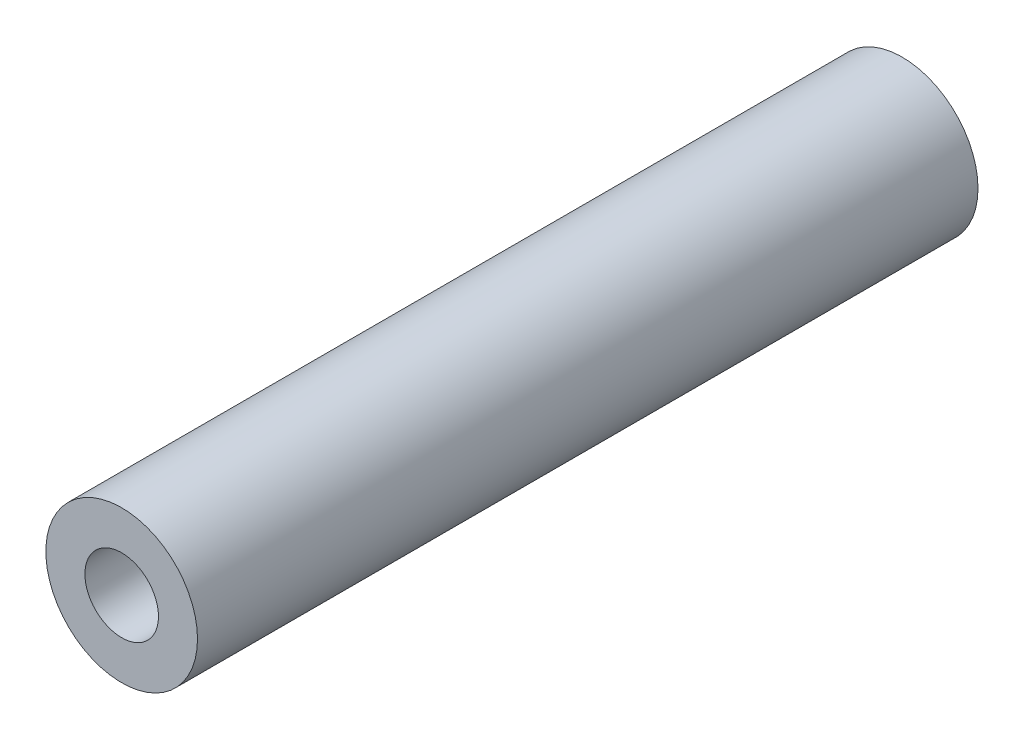
ISO-10303-21;
HEADER;
FILE_DESCRIPTION(('STEP AP214'),'2;1');
FILE_NAME('part.step','',(''),(''),'','','');
FILE_SCHEMA(('AUTOMOTIVE_DESIGN { 1 0 10303 214 1 1 1 1 }'));
ENDSEC;
DATA;
#1=APPLICATION_CONTEXT('core data for automotive mechanical design processes');
#2=APPLICATION_PROTOCOL_DEFINITION('international standard','automotive_design',2000,#1);
#3=PRODUCT_CONTEXT('',#1,'mechanical');
#4=PRODUCT('Part','Part','',(#3));
#5=PRODUCT_RELATED_PRODUCT_CATEGORY('part','',(#4));
#6=PRODUCT_DEFINITION_FORMATION('','',#4);
#7=PRODUCT_DEFINITION_CONTEXT('part definition',#1,'design');
#8=PRODUCT_DEFINITION('design','',#6,#7);
#9=PRODUCT_DEFINITION_SHAPE('','',#8);
#10=(LENGTH_UNIT() NAMED_UNIT(*) SI_UNIT(.MILLI.,.METRE.));
#11=(NAMED_UNIT(*) PLANE_ANGLE_UNIT() SI_UNIT($,.RADIAN.));
#12=(NAMED_UNIT(*) SI_UNIT($,.STERADIAN.) SOLID_ANGLE_UNIT());
#13=UNCERTAINTY_MEASURE_WITH_UNIT(LENGTH_MEASURE(1.E-05),#10,'distance_accuracy_value','');
#14=(GEOMETRIC_REPRESENTATION_CONTEXT(3) GLOBAL_UNCERTAINTY_ASSIGNED_CONTEXT((#13)) GLOBAL_UNIT_ASSIGNED_CONTEXT((#10,
#11,#12)) REPRESENTATION_CONTEXT('',''));
#15=CARTESIAN_POINT('',(0.,0.,0.));
#16=DIRECTION('',(0.,0.,1.));
#17=DIRECTION('',(1.,0.,0.));
#18=AXIS2_PLACEMENT_3D('',#15,#16,#17);
#19=CARTESIAN_POINT('',(0.,0.,35.));
#20=DIRECTION('',(0.,0.,1.));
#21=DIRECTION('',(1.,0.,0.));
#22=AXIS2_PLACEMENT_3D('',#19,#20,#21);
#23=PLANE('',#22);
#24=CARTESIAN_POINT('',(0.,0.,35.));
#25=DIRECTION('',(0.,0.,1.));
#26=DIRECTION('',(1.,0.,0.));
#27=AXIS2_PLACEMENT_3D('',#24,#25,#26);
#28=CIRCLE('',#27,3.4);
#29=CARTESIAN_POINT('',(3.4,0.,35.));
#30=VERTEX_POINT('',#29);
#31=EDGE_CURVE('E10',#30,#30,#28,.T.);
#32=ORIENTED_EDGE('',*,*,#31,.T.);
#33=EDGE_LOOP('',(#32));
#34=FACE_BOUND('',#33,.T.);
#35=CARTESIAN_POINT('',(0.,0.,35.));
#36=DIRECTION('',(0.,0.,1.));
#37=DIRECTION('',(1.,0.,0.));
#38=AXIS2_PLACEMENT_3D('',#35,#36,#37);
#39=CIRCLE('',#38,1.65);
#40=CARTESIAN_POINT('',(1.65,0.,35.));
#41=VERTEX_POINT('',#40);
#42=EDGE_CURVE('E57',#41,#41,#39,.T.);
#43=ORIENTED_EDGE('',*,*,#42,.F.);
#44=EDGE_LOOP('',(#43));
#45=FACE_BOUND('',#44,.T.);
#46=ADVANCED_FACE('F43',(#34,#45),#23,.T.);
#47=CARTESIAN_POINT('',(0.,0.,0.));
#48=DIRECTION('',(0.,0.,1.));
#49=DIRECTION('',(1.,0.,0.));
#50=AXIS2_PLACEMENT_3D('',#47,#48,#49);
#51=PLANE('',#50);
#52=CARTESIAN_POINT('',(0.,0.,0.));
#53=DIRECTION('',(0.,0.,1.));
#54=DIRECTION('',(1.,0.,0.));
#55=AXIS2_PLACEMENT_3D('',#52,#53,#54);
#56=CIRCLE('',#55,3.4);
#57=CARTESIAN_POINT('',(3.4,0.,0.));
#58=VERTEX_POINT('',#57);
#59=EDGE_CURVE('E47',#58,#58,#56,.T.);
#60=ORIENTED_EDGE('',*,*,#59,.F.);
#61=EDGE_LOOP('',(#60));
#62=FACE_BOUND('',#61,.T.);
#63=CARTESIAN_POINT('',(0.,0.,0.));
#64=DIRECTION('',(0.,0.,1.));
#65=DIRECTION('',(1.,0.,0.));
#66=AXIS2_PLACEMENT_3D('',#63,#64,#65);
#67=CIRCLE('',#66,1.65);
#68=CARTESIAN_POINT('',(1.65,0.,0.));
#69=VERTEX_POINT('',#68);
#70=EDGE_CURVE('E59',#69,#69,#67,.T.);
#71=ORIENTED_EDGE('',*,*,#70,.T.);
#72=EDGE_LOOP('',(#71));
#73=FACE_BOUND('',#72,.T.);
#74=ADVANCED_FACE('F70',(#62,#73),#51,.F.);
#75=CARTESIAN_POINT('',(0.,0.,35.));
#76=DIRECTION('',(0.,0.,-1.));
#77=DIRECTION('',(-1.,0.,0.));
#78=AXIS2_PLACEMENT_3D('',#75,#76,#77);
#79=CYLINDRICAL_SURFACE('',#78,3.4);
#80=ORIENTED_EDGE('',*,*,#31,.F.);
#81=EDGE_LOOP('',(#80));
#82=FACE_BOUND('',#81,.T.);
#83=ORIENTED_EDGE('',*,*,#59,.T.);
#84=EDGE_LOOP('',(#83));
#85=FACE_BOUND('',#84,.T.);
#86=ADVANCED_FACE('F45',(#82,#85),#79,.T.);
#87=CARTESIAN_POINT('',(0.,0.,35.));
#88=DIRECTION('',(0.,0.,-1.));
#89=DIRECTION('',(-1.,0.,0.));
#90=AXIS2_PLACEMENT_3D('',#87,#88,#89);
#91=CYLINDRICAL_SURFACE('',#90,1.65);
#92=ORIENTED_EDGE('',*,*,#42,.T.);
#93=EDGE_LOOP('',(#92));
#94=FACE_BOUND('',#93,.T.);
#95=ORIENTED_EDGE('',*,*,#70,.F.);
#96=EDGE_LOOP('',(#95));
#97=FACE_BOUND('',#96,.T.);
#98=ADVANCED_FACE('F66',(#94,#97),#91,.F.);
#99=CLOSED_SHELL('',(#46,#74,#86,#98));
#100=MANIFOLD_SOLID_BREP('B2',#99);
#101=ADVANCED_BREP_SHAPE_REPRESENTATION('',(#18,#100),#14);
#102=SHAPE_DEFINITION_REPRESENTATION(#9,#101);
ENDSEC;
END-ISO-10303-21;
